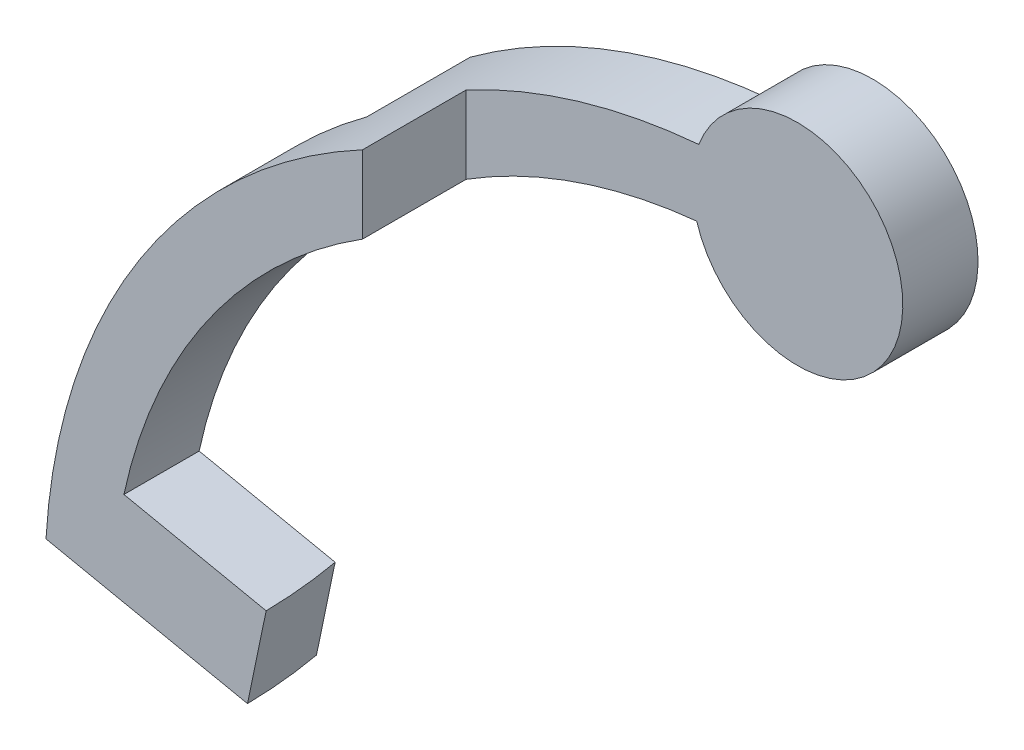
ISO-10303-21;
HEADER;
FILE_DESCRIPTION(('STEP AP214'),'2;1');
FILE_NAME('part.step','',(''),(''),'','','');
FILE_SCHEMA(('AUTOMOTIVE_DESIGN { 1 0 10303 214 1 1 1 1 }'));
ENDSEC;
DATA;
#1=APPLICATION_CONTEXT('core data for automotive mechanical design processes');
#2=APPLICATION_PROTOCOL_DEFINITION('international standard','automotive_design',2000,#1);
#3=PRODUCT_CONTEXT('',#1,'mechanical');
#4=PRODUCT('Part','Part','',(#3));
#5=PRODUCT_RELATED_PRODUCT_CATEGORY('part','',(#4));
#6=PRODUCT_DEFINITION_FORMATION('','',#4);
#7=PRODUCT_DEFINITION_CONTEXT('part definition',#1,'design');
#8=PRODUCT_DEFINITION('design','',#6,#7);
#9=PRODUCT_DEFINITION_SHAPE('','',#8);
#10=(LENGTH_UNIT() NAMED_UNIT(*) SI_UNIT(.MILLI.,.METRE.));
#11=(NAMED_UNIT(*) PLANE_ANGLE_UNIT() SI_UNIT($,.RADIAN.));
#12=(NAMED_UNIT(*) SI_UNIT($,.STERADIAN.) SOLID_ANGLE_UNIT());
#13=UNCERTAINTY_MEASURE_WITH_UNIT(LENGTH_MEASURE(1.E-05),#10,'distance_accuracy_value','');
#14=(GEOMETRIC_REPRESENTATION_CONTEXT(3) GLOBAL_UNCERTAINTY_ASSIGNED_CONTEXT((#13)) GLOBAL_UNIT_ASSIGNED_CONTEXT((#10,
#11,#12)) REPRESENTATION_CONTEXT('',''));
#15=CARTESIAN_POINT('',(0.,0.,0.));
#16=DIRECTION('',(0.,0.,1.));
#17=DIRECTION('',(1.,0.,0.));
#18=AXIS2_PLACEMENT_3D('',#15,#16,#17);
#19=CARTESIAN_POINT('',(0.,0.,0.));
#20=DIRECTION('',(0.,0.,1.));
#21=DIRECTION('',(1.,0.,0.));
#22=AXIS2_PLACEMENT_3D('',#19,#20,#21);
#23=PLANE('',#22);
#24=DIRECTION('',(0.,1.,0.));
#25=VECTOR('',#24,1.);
#26=CARTESIAN_POINT('',(-26.7522213143074,-37.8465318869941,0.));
#27=LINE('',#26,#25);
#28=CARTESIAN_POINT('',(-26.7522213143074,-10.8350760594294,0.));
#29=VERTEX_POINT('',#28);
#30=CARTESIAN_POINT('',(-26.7522213143074,-5.12154782560139,0.));
#31=VERTEX_POINT('',#30);
#32=EDGE_CURVE('E173',#29,#31,#27,.T.);
#33=ORIENTED_EDGE('',*,*,#32,.T.);
#34=CARTESIAN_POINT('',(-3.12824808202929,-37.4001458236651,0.));
#35=DIRECTION('',(0.,0.,1.));
#36=DIRECTION('',(1.,0.,0.));
#37=AXIS2_PLACEMENT_3D('',#34,#35,#36);
#38=CIRCLE('',#37,40.);
#39=CARTESIAN_POINT('',(-6.55624058274921,2.45269431872632,0.));
#40=VERTEX_POINT('',#39);
#41=EDGE_CURVE('E151',#40,#31,#38,.T.);
#42=ORIENTED_EDGE('',*,*,#41,.F.);
#43=CARTESIAN_POINT('',(0.,0.,0.));
#44=DIRECTION('',(0.,0.,1.));
#45=DIRECTION('',(1.,0.,0.));
#46=AXIS2_PLACEMENT_3D('',#43,#44,#45);
#47=CIRCLE('',#46,7.);
#48=CARTESIAN_POINT('',(-6.69917083103431,-2.0300517669801,0.));
#49=VERTEX_POINT('',#48);
#50=EDGE_CURVE('E57',#49,#40,#47,.T.);
#51=ORIENTED_EDGE('',*,*,#50,.F.);
#52=CARTESIAN_POINT('',(-3.12824808202929,-37.4001458236651,0.));
#53=DIRECTION('',(0.,0.,1.));
#54=DIRECTION('',(1.,0.,0.));
#55=AXIS2_PLACEMENT_3D('',#52,#53,#54);
#56=CIRCLE('',#55,35.5498951173995);
#57=EDGE_CURVE('E149',#29,#49,#56,.F.);
#58=ORIENTED_EDGE('',*,*,#57,.F.);
#59=EDGE_LOOP('',(#33,#42,#51,#58));
#60=FACE_BOUND('',#59,.T.);
#61=ADVANCED_FACE('F35',(#60),#23,.F.);
#62=CARTESIAN_POINT('',(-7.54083786418247,-36.2290461115529,45.));
#63=DIRECTION('',(-0.203776064234001,-0.979017525708963,0.));
#64=DIRECTION('',(0.979017525708963,-0.203776064234001,0.));
#65=AXIS2_PLACEMENT_3D('',#62,#63,#64);
#66=PLANE('',#65);
#67=DIRECTION('',(0.979017525708963,-0.203776064234001,0.));
#68=VECTOR('',#67,1.);
#69=CARTESIAN_POINT('',(-7.54083786418247,-36.2290461115529,11.8820734194004));
#70=LINE('',#69,#68);
#71=CARTESIAN_POINT('',(-37.8809726052462,-29.9139464493828,11.8820734194004));
#72=VERTEX_POINT('',#71);
#73=CARTESIAN_POINT('',(-28.4288232400276,-31.8813492237114,11.8820734194004));
#74=VERTEX_POINT('',#73);
#75=EDGE_CURVE('E124',#72,#74,#70,.T.);
#76=ORIENTED_EDGE('',*,*,#75,.T.);
#77=CARTESIAN_POINT('',(-62.4172678558015,-24.8068778364682,12.3041030636644));
#78=DIRECTION('',(-0.203776064234001,-0.979017525708963,0.));
#79=DIRECTION('',(0.979017525708963,-0.203776064234001,0.));
#80=AXIS2_PLACEMENT_3D('',#77,#78,#79);
#81=CIRCLE('',#80,34.7194559552579);
#82=CARTESIAN_POINT('',(-28.8433578281711,-31.7950665733579,6.88207341940044));
#83=VERTEX_POINT('',#82);
#84=EDGE_CURVE('E111',#83,#74,#81,.T.);
#85=ORIENTED_EDGE('',*,*,#84,.F.);
#86=DIRECTION('',(0.979017525708963,-0.203776064234001,0.));
#87=VECTOR('',#86,1.);
#88=CARTESIAN_POINT('',(-7.54083786418248,-36.2290461115529,6.88207341940044));
#89=LINE('',#88,#87);
#90=CARTESIAN_POINT('',(-37.8809726052462,-29.9139464493828,6.88207341940044));
#91=VERTEX_POINT('',#90);
#92=EDGE_CURVE('E198',#91,#83,#89,.T.);
#93=ORIENTED_EDGE('',*,*,#92,.F.);
#94=DIRECTION('',(0.,0.,-1.));
#95=VECTOR('',#94,1.);
#96=CARTESIAN_POINT('',(-37.8809726052462,-29.9139464493828,45.));
#97=LINE('',#96,#95);
#98=EDGE_CURVE('E134',#72,#91,#97,.T.);
#99=ORIENTED_EDGE('',*,*,#98,.F.);
#100=EDGE_LOOP('',(#76,#85,#93,#99));
#101=FACE_BOUND('',#100,.T.);
#102=ADVANCED_FACE('F132',(#101),#66,.F.);
#103=CARTESIAN_POINT('',(-3.12824808202929,-37.4001458236651,45.));
#104=DIRECTION('',(0.,0.,-1.));
#105=DIRECTION('',(-1.,0.,0.));
#106=AXIS2_PLACEMENT_3D('',#103,#104,#105);
#107=CYLINDRICAL_SURFACE('',#106,35.5498951173995);
#108=CARTESIAN_POINT('',(-3.12824808202929,-37.4001458236651,6.88207341940044));
#109=DIRECTION('',(0.,0.,-1.));
#110=DIRECTION('',(-1.,0.,0.));
#111=AXIS2_PLACEMENT_3D('',#108,#109,#110);
#112=CIRCLE('',#111,35.5498951173995);
#113=CARTESIAN_POINT('',(-26.7522213143074,-10.8350760594294,6.88207341940045));
#114=VERTEX_POINT('',#113);
#115=EDGE_CURVE('E192',#114,#91,#112,.F.);
#116=ORIENTED_EDGE('',*,*,#115,.F.);
#117=DIRECTION('',(0.,0.,-1.));
#118=VECTOR('',#117,1.);
#119=CARTESIAN_POINT('',(-26.7522213143074,-10.8350760594294,45.));
#120=LINE('',#119,#118);
#121=EDGE_CURVE('E191',#29,#114,#120,.F.);
#122=ORIENTED_EDGE('',*,*,#121,.F.);
#123=ORIENTED_EDGE('',*,*,#57,.T.);
#124=DIRECTION('',(0.,0.,-1.));
#125=VECTOR('',#124,1.);
#126=CARTESIAN_POINT('',(-6.69917083103431,-2.0300517669801,45.));
#127=LINE('',#126,#125);
#128=CARTESIAN_POINT('',(-6.69917083103431,-2.0300517669801,5.));
#129=VERTEX_POINT('',#128);
#130=EDGE_CURVE('E159',#129,#49,#127,.T.);
#131=ORIENTED_EDGE('',*,*,#130,.F.);
#132=CARTESIAN_POINT('',(-3.12824808202929,-37.4001458236651,5.));
#133=DIRECTION('',(0.,0.,-1.));
#134=DIRECTION('',(-1.,0.,0.));
#135=AXIS2_PLACEMENT_3D('',#132,#133,#134);
#136=CIRCLE('',#135,35.5498951173995);
#137=CARTESIAN_POINT('',(-22.0211860396389,-7.28616338712874,5.00000000000001));
#138=VERTEX_POINT('',#137);
#139=EDGE_CURVE('E146',#129,#138,#136,.F.);
#140=ORIENTED_EDGE('',*,*,#139,.T.);
#141=DIRECTION('',(0.,0.,-1.));
#142=VECTOR('',#141,1.);
#143=CARTESIAN_POINT('',(-22.0211860396389,-7.28616338712874,45.));
#144=LINE('',#143,#142);
#145=CARTESIAN_POINT('',(-22.0211860396389,-7.28616338712873,11.8820734194004));
#146=VERTEX_POINT('',#145);
#147=EDGE_CURVE('E138',#138,#146,#144,.F.);
#148=ORIENTED_EDGE('',*,*,#147,.T.);
#149=CARTESIAN_POINT('',(-3.12824808202929,-37.4001458236651,11.8820734194004));
#150=DIRECTION('',(0.,0.,-1.));
#151=DIRECTION('',(-1.,0.,0.));
#152=AXIS2_PLACEMENT_3D('',#149,#150,#151);
#153=CIRCLE('',#152,35.5498951173995);
#154=EDGE_CURVE('E135',#146,#72,#153,.F.);
#155=ORIENTED_EDGE('',*,*,#154,.T.);
#156=ORIENTED_EDGE('',*,*,#98,.T.);
#157=EDGE_LOOP('',(#116,#122,#123,#131,#140,#148,#155,#156));
#158=FACE_BOUND('',#157,.T.);
#159=ADVANCED_FACE('F190',(#158),#107,.F.);
#160=CARTESIAN_POINT('',(-3.12824808202929,-37.4001458236651,45.));
#161=DIRECTION('',(0.,0.,-1.));
#162=DIRECTION('',(-1.,0.,0.));
#163=AXIS2_PLACEMENT_3D('',#160,#161,#162);
#164=CYLINDRICAL_SURFACE('',#163,40.);
#165=CARTESIAN_POINT('',(-3.12824808202929,-37.4001458236651,6.88207341940044));
#166=DIRECTION('',(0.,0.,-1.));
#167=DIRECTION('',(-1.,0.,0.));
#168=AXIS2_PLACEMENT_3D('',#165,#166,#167);
#169=CIRCLE('',#168,40.);
#170=CARTESIAN_POINT('',(-43.0597148745306,-35.0596416473472,6.88207341940045));
#171=VERTEX_POINT('',#170);
#172=CARTESIAN_POINT('',(-26.7522213143074,-5.12154782560139,6.88207341940045));
#173=VERTEX_POINT('',#172);
#174=EDGE_CURVE('E207',#171,#173,#169,.T.);
#175=ORIENTED_EDGE('',*,*,#174,.F.);
#176=DIRECTION('',(0.,0.,-1.));
#177=VECTOR('',#176,1.);
#178=CARTESIAN_POINT('',(-43.0597148745306,-35.0596416473472,45.));
#179=LINE('',#178,#177);
#180=CARTESIAN_POINT('',(-43.0597148745306,-35.0596416473472,11.8820734194004));
#181=VERTEX_POINT('',#180);
#182=EDGE_CURVE('E154',#181,#171,#179,.T.);
#183=ORIENTED_EDGE('',*,*,#182,.F.);
#184=CARTESIAN_POINT('',(-3.12824808202929,-37.4001458236651,11.8820734194004));
#185=DIRECTION('',(0.,0.,-1.));
#186=DIRECTION('',(-1.,0.,0.));
#187=AXIS2_PLACEMENT_3D('',#184,#185,#186);
#188=CIRCLE('',#187,40.);
#189=CARTESIAN_POINT('',(-22.0211860396389,-2.14313382137097,11.8820734194004));
#190=VERTEX_POINT('',#189);
#191=EDGE_CURVE('E136',#181,#190,#188,.T.);
#192=ORIENTED_EDGE('',*,*,#191,.T.);
#193=DIRECTION('',(0.,0.,-1.));
#194=VECTOR('',#193,1.);
#195=CARTESIAN_POINT('',(-22.0211860396389,-2.14313382137098,45.));
#196=LINE('',#195,#194);
#197=CARTESIAN_POINT('',(-22.0211860396389,-2.14313382137098,5.00000000000001));
#198=VERTEX_POINT('',#197);
#199=EDGE_CURVE('E128',#190,#198,#196,.T.);
#200=ORIENTED_EDGE('',*,*,#199,.T.);
#201=CARTESIAN_POINT('',(-3.12824808202929,-37.4001458236651,5.));
#202=DIRECTION('',(0.,0.,-1.));
#203=DIRECTION('',(-1.,0.,0.));
#204=AXIS2_PLACEMENT_3D('',#201,#202,#203);
#205=CIRCLE('',#204,40.);
#206=CARTESIAN_POINT('',(-6.55624058274921,2.45269431872631,5.));
#207=VERTEX_POINT('',#206);
#208=EDGE_CURVE('E166',#198,#207,#205,.T.);
#209=ORIENTED_EDGE('',*,*,#208,.T.);
#210=DIRECTION('',(0.,0.,-1.));
#211=VECTOR('',#210,1.);
#212=CARTESIAN_POINT('',(-6.55624058274921,2.45269431872632,45.));
#213=LINE('',#212,#211);
#214=EDGE_CURVE('E157',#207,#40,#213,.T.);
#215=ORIENTED_EDGE('',*,*,#214,.T.);
#216=ORIENTED_EDGE('',*,*,#41,.T.);
#217=DIRECTION('',(0.,0.,-1.));
#218=VECTOR('',#217,1.);
#219=CARTESIAN_POINT('',(-26.7522213143074,-5.12154782560139,45.));
#220=LINE('',#219,#218);
#221=EDGE_CURVE('E43',#173,#31,#220,.T.);
#222=ORIENTED_EDGE('',*,*,#221,.F.);
#223=EDGE_LOOP('',(#175,#183,#192,#200,#209,#215,#216,#222));
#224=FACE_BOUND('',#223,.T.);
#225=ADVANCED_FACE('F184',(#224),#164,.T.);
#226=CARTESIAN_POINT('',(-8.78245143456309,-42.1942287748356,45.));
#227=DIRECTION('',(0.203776064234002,0.979017525708963,0.));
#228=DIRECTION('',(-0.979017525708963,0.203776064234002,0.));
#229=AXIS2_PLACEMENT_3D('',#226,#227,#228);
#230=PLANE('',#229);
#231=DIRECTION('',(-0.979017525708963,0.203776064234002,0.));
#232=VECTOR('',#231,1.);
#233=CARTESIAN_POINT('',(-8.78245143456309,-42.1942287748356,6.88207341940044));
#234=LINE('',#233,#232);
#235=CARTESIAN_POINT('',(-30.0849713985517,-37.7602492366405,6.88207341940044));
#236=VERTEX_POINT('',#235);
#237=EDGE_CURVE('E182',#236,#171,#234,.T.);
#238=ORIENTED_EDGE('',*,*,#237,.F.);
#239=CARTESIAN_POINT('',(-63.6588814261821,-30.7720604997508,12.3041030636644));
#240=DIRECTION('',(0.203776064234002,0.979017525708963,0.));
#241=DIRECTION('',(-0.979017525708963,0.203776064234002,0.));
#242=AXIS2_PLACEMENT_3D('',#239,#240,#241);
#243=CIRCLE('',#242,34.7194559552579);
#244=CARTESIAN_POINT('',(-29.6704368104082,-37.8465318869941,11.8820734194004));
#245=VERTEX_POINT('',#244);
#246=EDGE_CURVE('E49',#236,#245,#243,.F.);
#247=ORIENTED_EDGE('',*,*,#246,.T.);
#248=DIRECTION('',(-0.979017525708963,0.203776064234002,0.));
#249=VECTOR('',#248,1.);
#250=CARTESIAN_POINT('',(-8.78245143456309,-42.1942287748356,11.8820734194004));
#251=LINE('',#250,#249);
#252=EDGE_CURVE('E127',#245,#181,#251,.T.);
#253=ORIENTED_EDGE('',*,*,#252,.T.);
#254=ORIENTED_EDGE('',*,*,#182,.T.);
#255=EDGE_LOOP('',(#238,#247,#253,#254));
#256=FACE_BOUND('',#255,.T.);
#257=ADVANCED_FACE('F206',(#256),#230,.F.);
#258=CARTESIAN_POINT('',(0.,0.,5.));
#259=DIRECTION('',(0.,0.,-1.));
#260=DIRECTION('',(-1.,0.,0.));
#261=AXIS2_PLACEMENT_3D('',#258,#259,#260);
#262=CYLINDRICAL_SURFACE('',#261,7.);
#263=ORIENTED_EDGE('',*,*,#130,.T.);
#264=ORIENTED_EDGE('',*,*,#50,.T.);
#265=ORIENTED_EDGE('',*,*,#214,.F.);
#266=CARTESIAN_POINT('',(0.,0.,5.));
#267=DIRECTION('',(0.,0.,1.));
#268=DIRECTION('',(1.,0.,0.));
#269=AXIS2_PLACEMENT_3D('',#266,#267,#268);
#270=CIRCLE('',#269,7.);
#271=EDGE_CURVE('E129',#129,#207,#270,.T.);
#272=ORIENTED_EDGE('',*,*,#271,.F.);
#273=EDGE_LOOP('',(#263,#264,#265,#272));
#274=FACE_BOUND('',#273,.T.);
#275=ADVANCED_FACE('F37',(#274),#262,.T.);
#276=CARTESIAN_POINT('',(0.,0.,5.));
#277=DIRECTION('',(0.,0.,1.));
#278=DIRECTION('',(1.,0.,0.));
#279=AXIS2_PLACEMENT_3D('',#276,#277,#278);
#280=PLANE('',#279);
#281=ORIENTED_EDGE('',*,*,#271,.T.);
#282=ORIENTED_EDGE('',*,*,#208,.F.);
#283=DIRECTION('',(0.,-1.,0.));
#284=VECTOR('',#283,1.);
#285=CARTESIAN_POINT('',(-22.0211860396389,5.,5.00000000000001));
#286=LINE('',#285,#284);
#287=EDGE_CURVE('E196',#198,#138,#286,.T.);
#288=ORIENTED_EDGE('',*,*,#287,.T.);
#289=ORIENTED_EDGE('',*,*,#139,.F.);
#290=EDGE_LOOP('',(#281,#282,#288,#289));
#291=FACE_BOUND('',#290,.T.);
#292=ADVANCED_FACE('F217',(#291),#280,.T.);
#293=CARTESIAN_POINT('',(-22.0211860396389,5.,0.));
#294=DIRECTION('',(-1.,0.,0.));
#295=DIRECTION('',(0.,0.,1.));
#296=AXIS2_PLACEMENT_3D('',#293,#294,#295);
#297=PLANE('',#296);
#298=ORIENTED_EDGE('',*,*,#287,.F.);
#299=ORIENTED_EDGE('',*,*,#199,.F.);
#300=DIRECTION('',(0.,-1.,0.));
#301=VECTOR('',#300,1.);
#302=CARTESIAN_POINT('',(-22.0211860396389,5.,11.8820734194004));
#303=LINE('',#302,#301);
#304=EDGE_CURVE('E193',#190,#146,#303,.T.);
#305=ORIENTED_EDGE('',*,*,#304,.T.);
#306=ORIENTED_EDGE('',*,*,#147,.F.);
#307=EDGE_LOOP('',(#298,#299,#305,#306));
#308=FACE_BOUND('',#307,.T.);
#309=ADVANCED_FACE('F216',(#308),#297,.F.);
#310=CARTESIAN_POINT('',(0.,5.,11.8820734194004));
#311=DIRECTION('',(0.,0.,-1.));
#312=DIRECTION('',(-1.,0.,0.));
#313=AXIS2_PLACEMENT_3D('',#310,#311,#312);
#314=PLANE('',#313);
#315=ORIENTED_EDGE('',*,*,#304,.F.);
#316=ORIENTED_EDGE('',*,*,#191,.F.);
#317=ORIENTED_EDGE('',*,*,#252,.F.);
#318=DIRECTION('',(-0.203776064234001,-0.979017525708963,0.));
#319=VECTOR('',#318,1.);
#320=CARTESIAN_POINT('',(-20.8879853758451,4.34769688784146,11.8820734194004));
#321=LINE('',#320,#319);
#322=EDGE_CURVE('E114',#74,#245,#321,.T.);
#323=ORIENTED_EDGE('',*,*,#322,.F.);
#324=ORIENTED_EDGE('',*,*,#75,.F.);
#325=ORIENTED_EDGE('',*,*,#154,.F.);
#326=EDGE_LOOP('',(#315,#316,#317,#323,#324,#325));
#327=FACE_BOUND('',#326,.T.);
#328=ADVANCED_FACE('F123',(#327),#314,.F.);
#329=CARTESIAN_POINT('',(-26.7522213143074,-37.8465318869941,0.));
#330=DIRECTION('',(-1.,0.,0.));
#331=DIRECTION('',(0.,0.,1.));
#332=AXIS2_PLACEMENT_3D('',#329,#330,#331);
#333=PLANE('',#332);
#334=ORIENTED_EDGE('',*,*,#121,.T.);
#335=DIRECTION('',(0.,1.,0.));
#336=VECTOR('',#335,1.);
#337=CARTESIAN_POINT('',(-26.7522213143074,-37.8465318869941,6.88207341940045));
#338=LINE('',#337,#336);
#339=EDGE_CURVE('E176',#114,#173,#338,.T.);
#340=ORIENTED_EDGE('',*,*,#339,.T.);
#341=ORIENTED_EDGE('',*,*,#221,.T.);
#342=ORIENTED_EDGE('',*,*,#32,.F.);
#343=EDGE_LOOP('',(#334,#340,#341,#342));
#344=FACE_BOUND('',#343,.T.);
#345=ADVANCED_FACE('F172',(#344),#333,.T.);
#346=CARTESIAN_POINT('',(0.,-37.8465318869941,6.88207341940044));
#347=DIRECTION('',(0.,0.,-1.));
#348=DIRECTION('',(-1.,0.,0.));
#349=AXIS2_PLACEMENT_3D('',#346,#347,#348);
#350=PLANE('',#349);
#351=DIRECTION('',(0.203776064234001,0.979017525708963,0.));
#352=VECTOR('',#351,1.);
#353=CARTESIAN_POINT('',(-30.6409569439016,-40.4314147387549,6.88207341940045));
#354=LINE('',#353,#352);
#355=EDGE_CURVE('E11',#236,#83,#354,.T.);
#356=ORIENTED_EDGE('',*,*,#355,.F.);
#357=ORIENTED_EDGE('',*,*,#237,.T.);
#358=ORIENTED_EDGE('',*,*,#174,.T.);
#359=ORIENTED_EDGE('',*,*,#339,.F.);
#360=ORIENTED_EDGE('',*,*,#115,.T.);
#361=ORIENTED_EDGE('',*,*,#92,.T.);
#362=EDGE_LOOP('',(#356,#357,#358,#359,#360,#361));
#363=FACE_BOUND('',#362,.T.);
#364=ADVANCED_FACE('F213',(#363),#350,.T.);
#365=CARTESIAN_POINT('',(-64.2148669715321,-33.4432260018652,12.3041030636644));
#366=DIRECTION('',(0.203776064234001,0.979017525708963,0.));
#367=DIRECTION('',(-0.979017525708963,0.203776064234001,0.));
#368=AXIS2_PLACEMENT_3D('',#365,#366,#367);
#369=CYLINDRICAL_SURFACE('',#368,34.7194559552579);
#370=ORIENTED_EDGE('',*,*,#355,.T.);
#371=ORIENTED_EDGE('',*,*,#84,.T.);
#372=ORIENTED_EDGE('',*,*,#322,.T.);
#373=ORIENTED_EDGE('',*,*,#246,.F.);
#374=EDGE_LOOP('',(#370,#371,#372,#373));
#375=FACE_BOUND('',#374,.T.);
#376=ADVANCED_FACE('F113',(#375),#369,.T.);
#377=CLOSED_SHELL('',(#61,#102,#159,#225,#257,#275,#292,#309,#328,#345,#364,#376));
#378=MANIFOLD_SOLID_BREP('B2',#377);
#379=ADVANCED_BREP_SHAPE_REPRESENTATION('',(#18,#378),#14);
#380=SHAPE_DEFINITION_REPRESENTATION(#9,#379);
ENDSEC;
END-ISO-10303-21;
